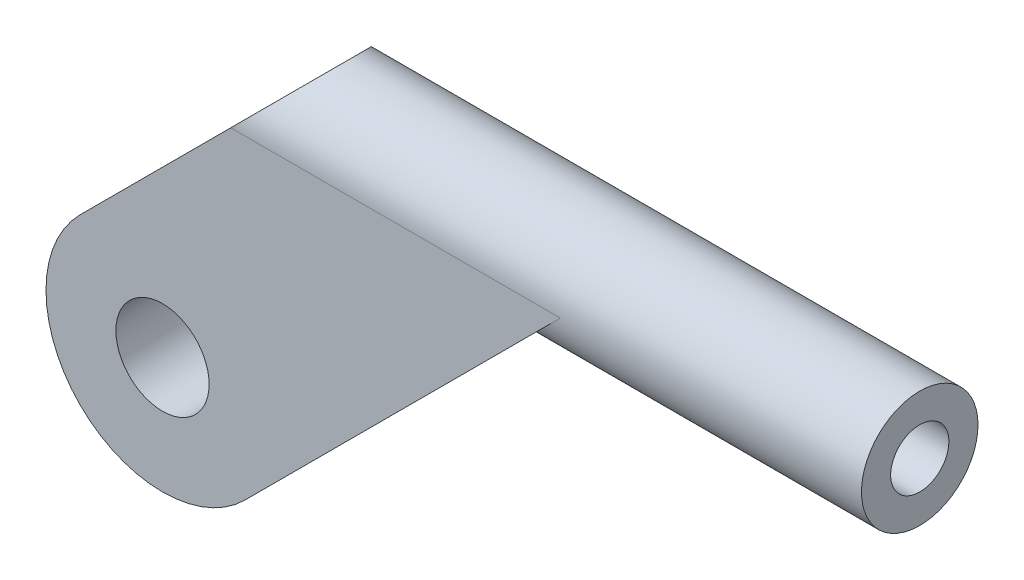
ISO-10303-21;
HEADER;
FILE_DESCRIPTION(('STEP AP214'),'2;1');
FILE_NAME('part.step','',(''),(''),'','','');
FILE_SCHEMA(('AUTOMOTIVE_DESIGN { 1 0 10303 214 1 1 1 1 }'));
ENDSEC;
DATA;
#1=APPLICATION_CONTEXT('core data for automotive mechanical design processes');
#2=APPLICATION_PROTOCOL_DEFINITION('international standard','automotive_design',2000,#1);
#3=PRODUCT_CONTEXT('',#1,'mechanical');
#4=PRODUCT('Part','Part','',(#3));
#5=PRODUCT_RELATED_PRODUCT_CATEGORY('part','',(#4));
#6=PRODUCT_DEFINITION_FORMATION('','',#4);
#7=PRODUCT_DEFINITION_CONTEXT('part definition',#1,'design');
#8=PRODUCT_DEFINITION('design','',#6,#7);
#9=PRODUCT_DEFINITION_SHAPE('','',#8);
#10=(LENGTH_UNIT() NAMED_UNIT(*) SI_UNIT(.MILLI.,.METRE.));
#11=(NAMED_UNIT(*) PLANE_ANGLE_UNIT() SI_UNIT($,.RADIAN.));
#12=(NAMED_UNIT(*) SI_UNIT($,.STERADIAN.) SOLID_ANGLE_UNIT());
#13=UNCERTAINTY_MEASURE_WITH_UNIT(LENGTH_MEASURE(1.E-05),#10,'distance_accuracy_value','');
#14=(GEOMETRIC_REPRESENTATION_CONTEXT(3) GLOBAL_UNCERTAINTY_ASSIGNED_CONTEXT((#13)) GLOBAL_UNIT_ASSIGNED_CONTEXT((#10,
#11,#12)) REPRESENTATION_CONTEXT('',''));
#15=CARTESIAN_POINT('',(0.,0.,0.));
#16=DIRECTION('',(0.,0.,1.));
#17=DIRECTION('',(1.,0.,0.));
#18=AXIS2_PLACEMENT_3D('',#15,#16,#17);
#19=CARTESIAN_POINT('',(0.,0.,-75.));
#20=DIRECTION('',(0.,0.,1.));
#21=DIRECTION('',(1.,0.,0.));
#22=AXIS2_PLACEMENT_3D('',#19,#20,#21);
#23=PLANE('',#22);
#24=CARTESIAN_POINT('',(0.,0.,-75.));
#25=DIRECTION('',(0.,0.,-1.));
#26=DIRECTION('',(-1.,0.,0.));
#27=AXIS2_PLACEMENT_3D('',#24,#25,#26);
#28=CIRCLE('',#27,100.);
#29=CARTESIAN_POINT('',(-100.,0.,-75.));
#30=VERTEX_POINT('',#29);
#31=EDGE_CURVE('E111',#30,#30,#28,.T.);
#32=ORIENTED_EDGE('',*,*,#31,.F.);
#33=EDGE_LOOP('',(#32));
#34=FACE_BOUND('',#33,.T.);
#35=DIRECTION('',(1.,0.,0.));
#36=VECTOR('',#35,1.);
#37=CARTESIAN_POINT('',(-250.001000000001,500.000000000001,-75.));
#38=LINE('',#37,#36);
#39=CARTESIAN_POINT('',(146.446609406725,500.000000000001,-75.));
#40=VERTEX_POINT('',#39);
#41=CARTESIAN_POINT('',(853.553390593275,500.000000000001,-75.));
#42=VERTEX_POINT('',#41);
#43=EDGE_CURVE('E80',#40,#42,#38,.T.);
#44=ORIENTED_EDGE('',*,*,#43,.T.);
#45=DIRECTION('',(0.707106781186548,0.707106781186547,0.));
#46=VECTOR('',#45,1.);
#47=CARTESIAN_POINT('',(176.776695296637,-176.776695296637,-75.));
#48=LINE('',#47,#46);
#49=CARTESIAN_POINT('',(176.776695296637,-176.776695296637,-75.));
#50=VERTEX_POINT('',#49);
#51=EDGE_CURVE('E48',#50,#42,#48,.T.);
#52=ORIENTED_EDGE('',*,*,#51,.F.);
#53=CARTESIAN_POINT('',(0.,0.,-75.));
#54=DIRECTION('',(0.,0.,1.));
#55=DIRECTION('',(1.,0.,0.));
#56=AXIS2_PLACEMENT_3D('',#53,#54,#55);
#57=CIRCLE('',#56,250.000000000001);
#58=CARTESIAN_POINT('',(-176.776695296638,176.776695296638,-75.));
#59=VERTEX_POINT('',#58);
#60=EDGE_CURVE('E103',#59,#50,#57,.T.);
#61=ORIENTED_EDGE('',*,*,#60,.F.);
#62=DIRECTION('',(-0.707106781186547,-0.707106781186548,0.));
#63=VECTOR('',#62,1.);
#64=CARTESIAN_POINT('',(-176.776695296638,176.776695296638,-75.));
#65=LINE('',#64,#63);
#66=EDGE_CURVE('E107',#40,#59,#65,.T.);
#67=ORIENTED_EDGE('',*,*,#66,.F.);
#68=EDGE_LOOP('',(#44,#52,#61,#67));
#69=FACE_BOUND('',#68,.T.);
#70=ADVANCED_FACE('F33',(#34,#69),#23,.F.);
#71=CARTESIAN_POINT('',(0.,0.,175.));
#72=DIRECTION('',(0.,0.,1.));
#73=DIRECTION('',(1.,0.,0.));
#74=AXIS2_PLACEMENT_3D('',#71,#72,#73);
#75=PLANE('',#74);
#76=CARTESIAN_POINT('',(0.,0.,175.));
#77=DIRECTION('',(0.,0.,1.));
#78=DIRECTION('',(1.,0.,0.));
#79=AXIS2_PLACEMENT_3D('',#76,#77,#78);
#80=CIRCLE('',#79,100.);
#81=CARTESIAN_POINT('',(100.,0.,175.));
#82=VERTEX_POINT('',#81);
#83=EDGE_CURVE('E114',#82,#82,#80,.F.);
#84=ORIENTED_EDGE('',*,*,#83,.T.);
#85=EDGE_LOOP('',(#84));
#86=FACE_BOUND('',#85,.T.);
#87=DIRECTION('',(0.707106781186548,0.707106781186547,0.));
#88=VECTOR('',#87,1.);
#89=CARTESIAN_POINT('',(176.776695296637,-176.776695296637,175.));
#90=LINE('',#89,#88);
#91=CARTESIAN_POINT('',(176.776695296637,-176.776695296637,175.));
#92=VERTEX_POINT('',#91);
#93=CARTESIAN_POINT('',(853.553390593275,500.000000000001,175.));
#94=VERTEX_POINT('',#93);
#95=EDGE_CURVE('E56',#92,#94,#90,.T.);
#96=ORIENTED_EDGE('',*,*,#95,.T.);
#97=DIRECTION('',(1.,0.,0.));
#98=VECTOR('',#97,1.);
#99=CARTESIAN_POINT('',(-250.001000000001,500.000000000001,175.));
#100=LINE('',#99,#98);
#101=CARTESIAN_POINT('',(146.446609406725,500.000000000001,175.));
#102=VERTEX_POINT('',#101);
#103=EDGE_CURVE('E79',#102,#94,#100,.T.);
#104=ORIENTED_EDGE('',*,*,#103,.F.);
#105=DIRECTION('',(-0.707106781186547,-0.707106781186548,0.));
#106=VECTOR('',#105,1.);
#107=CARTESIAN_POINT('',(500.,853.553390593276,175.));
#108=LINE('',#107,#106);
#109=CARTESIAN_POINT('',(-176.776695296638,176.776695296638,175.));
#110=VERTEX_POINT('',#109);
#111=EDGE_CURVE('E87',#102,#110,#108,.T.);
#112=ORIENTED_EDGE('',*,*,#111,.T.);
#113=CARTESIAN_POINT('',(0.,0.,175.));
#114=DIRECTION('',(0.,0.,1.));
#115=DIRECTION('',(1.,0.,0.));
#116=AXIS2_PLACEMENT_3D('',#113,#114,#115);
#117=CIRCLE('',#116,250.000000000001);
#118=EDGE_CURVE('E93',#110,#92,#117,.T.);
#119=ORIENTED_EDGE('',*,*,#118,.T.);
#120=EDGE_LOOP('',(#96,#104,#112,#119));
#121=FACE_BOUND('',#120,.T.);
#122=ADVANCED_FACE('F86',(#86,#121),#75,.T.);
#123=CARTESIAN_POINT('',(0.,0.,-75.));
#124=DIRECTION('',(0.,0.,1.));
#125=DIRECTION('',(1.,0.,0.));
#126=AXIS2_PLACEMENT_3D('',#123,#124,#125);
#127=CYLINDRICAL_SURFACE('',#126,250.000000000001);
#128=DIRECTION('',(0.,0.,1.));
#129=VECTOR('',#128,1.);
#130=CARTESIAN_POINT('',(176.776695296637,-176.776695296637,-75.));
#131=LINE('',#130,#129);
#132=EDGE_CURVE('E37',#50,#92,#131,.T.);
#133=ORIENTED_EDGE('',*,*,#132,.T.);
#134=ORIENTED_EDGE('',*,*,#118,.F.);
#135=DIRECTION('',(0.,0.,1.));
#136=VECTOR('',#135,1.);
#137=CARTESIAN_POINT('',(-176.776695296638,176.776695296638,-75.));
#138=LINE('',#137,#136);
#139=EDGE_CURVE('E11',#59,#110,#138,.T.);
#140=ORIENTED_EDGE('',*,*,#139,.F.);
#141=ORIENTED_EDGE('',*,*,#60,.T.);
#142=EDGE_LOOP('',(#133,#134,#140,#141));
#143=FACE_BOUND('',#142,.T.);
#144=ADVANCED_FACE('F35',(#143),#127,.T.);
#145=CARTESIAN_POINT('',(-176.776695296638,176.776695296638,-75.));
#146=DIRECTION('',(-0.707106781186548,0.707106781186547,0.));
#147=DIRECTION('',(-0.707106781186547,-0.707106781186548,0.));
#148=AXIS2_PLACEMENT_3D('',#145,#146,#147);
#149=PLANE('',#148);
#150=CARTESIAN_POINT('',(146.446609406725,500.000000000001,50.));
#151=DIRECTION('',(-0.707106781186548,0.707106781186547,0.));
#152=DIRECTION('',(0.707106781186547,0.707106781186548,0.));
#153=AXIS2_PLACEMENT_3D('',#150,#151,#152);
#154=ELLIPSE('',#153,176.776695296637,125.);
#155=EDGE_CURVE('E76',#102,#40,#154,.T.);
#156=ORIENTED_EDGE('',*,*,#155,.T.);
#157=ORIENTED_EDGE('',*,*,#66,.T.);
#158=ORIENTED_EDGE('',*,*,#139,.T.);
#159=ORIENTED_EDGE('',*,*,#111,.F.);
#160=EDGE_LOOP('',(#156,#157,#158,#159));
#161=FACE_BOUND('',#160,.T.);
#162=ADVANCED_FACE('F90',(#161),#149,.T.);
#163=CARTESIAN_POINT('',(176.776695296637,-176.776695296637,-75.));
#164=DIRECTION('',(0.707106781186547,-0.707106781186548,0.));
#165=DIRECTION('',(0.707106781186548,0.707106781186547,0.));
#166=AXIS2_PLACEMENT_3D('',#163,#164,#165);
#167=PLANE('',#166);
#168=ORIENTED_EDGE('',*,*,#51,.T.);
#169=CARTESIAN_POINT('',(853.553390593275,500.000000000001,50.));
#170=DIRECTION('',(0.707106781186547,-0.707106781186548,0.));
#171=DIRECTION('',(-0.707106781186548,-0.707106781186547,0.));
#172=AXIS2_PLACEMENT_3D('',#169,#170,#171);
#173=ELLIPSE('',#172,176.776695296637,125.);
#174=EDGE_CURVE('E84',#42,#94,#173,.F.);
#175=ORIENTED_EDGE('',*,*,#174,.T.);
#176=ORIENTED_EDGE('',*,*,#95,.F.);
#177=ORIENTED_EDGE('',*,*,#132,.F.);
#178=EDGE_LOOP('',(#168,#175,#176,#177));
#179=FACE_BOUND('',#178,.T.);
#180=ADVANCED_FACE('F110',(#179),#167,.T.);
#181=CARTESIAN_POINT('',(1500.,500.000000000001,50.));
#182=DIRECTION('',(1.,0.,0.));
#183=DIRECTION('',(0.,0.,-1.));
#184=AXIS2_PLACEMENT_3D('',#181,#182,#183);
#185=PLANE('',#184);
#186=CARTESIAN_POINT('',(1500.,500.000000000001,50.));
#187=DIRECTION('',(1.,0.,0.));
#188=DIRECTION('',(0.,0.,-1.));
#189=AXIS2_PLACEMENT_3D('',#186,#187,#188);
#190=CIRCLE('',#189,125.);
#191=CARTESIAN_POINT('',(1500.,500.000000000001,-75.));
#192=VERTEX_POINT('',#191);
#193=EDGE_CURVE('E94',#192,#192,#190,.T.);
#194=ORIENTED_EDGE('',*,*,#193,.T.);
#195=EDGE_LOOP('',(#194));
#196=FACE_BOUND('',#195,.T.);
#197=CARTESIAN_POINT('',(1500.,500.000000000001,50.));
#198=DIRECTION('',(1.,0.,0.));
#199=DIRECTION('',(0.,0.,-1.));
#200=AXIS2_PLACEMENT_3D('',#197,#198,#199);
#201=CIRCLE('',#200,62.5);
#202=CARTESIAN_POINT('',(1500.,500.000000000001,-12.5));
#203=VERTEX_POINT('',#202);
#204=EDGE_CURVE('E98',#203,#203,#201,.T.);
#205=ORIENTED_EDGE('',*,*,#204,.F.);
#206=EDGE_LOOP('',(#205));
#207=FACE_BOUND('',#206,.T.);
#208=ADVANCED_FACE('F135',(#196,#207),#185,.T.);
#209=CARTESIAN_POINT('',(1500.,500.000000000001,50.));
#210=DIRECTION('',(-1.,0.,0.));
#211=DIRECTION('',(0.,0.,1.));
#212=AXIS2_PLACEMENT_3D('',#209,#210,#211);
#213=CYLINDRICAL_SURFACE('',#212,125.);
#214=ORIENTED_EDGE('',*,*,#193,.F.);
#215=EDGE_LOOP('',(#214));
#216=FACE_BOUND('',#215,.T.);
#217=ORIENTED_EDGE('',*,*,#174,.F.);
#218=ORIENTED_EDGE('',*,*,#43,.F.);
#219=ORIENTED_EDGE('',*,*,#155,.F.);
#220=ORIENTED_EDGE('',*,*,#103,.T.);
#221=EDGE_LOOP('',(#217,#218,#219,#220));
#222=FACE_BOUND('',#221,.T.);
#223=ADVANCED_FACE('F78',(#216,#222),#213,.T.);
#224=CARTESIAN_POINT('',(1500.,500.000000000001,50.));
#225=DIRECTION('',(-1.,0.,0.));
#226=DIRECTION('',(0.,0.,1.));
#227=AXIS2_PLACEMENT_3D('',#224,#225,#226);
#228=CYLINDRICAL_SURFACE('',#227,62.5);
#229=ORIENTED_EDGE('',*,*,#204,.T.);
#230=EDGE_LOOP('',(#229));
#231=FACE_BOUND('',#230,.T.);
#232=CARTESIAN_POINT('',(500.,500.000000000001,50.));
#233=DIRECTION('',(1.,0.,0.));
#234=DIRECTION('',(0.,0.,-1.));
#235=AXIS2_PLACEMENT_3D('',#232,#233,#234);
#236=CIRCLE('',#235,62.5);
#237=CARTESIAN_POINT('',(500.,500.000000000001,-12.5));
#238=VERTEX_POINT('',#237);
#239=EDGE_CURVE('E88',#238,#238,#236,.T.);
#240=ORIENTED_EDGE('',*,*,#239,.F.);
#241=EDGE_LOOP('',(#240));
#242=FACE_BOUND('',#241,.T.);
#243=ADVANCED_FACE('F125',(#231,#242),#228,.F.);
#244=CARTESIAN_POINT('',(500.,853.553390593276,-75.));
#245=DIRECTION('',(1.,0.,0.));
#246=DIRECTION('',(0.,1.,0.));
#247=AXIS2_PLACEMENT_3D('',#244,#245,#246);
#248=PLANE('',#247);
#249=ORIENTED_EDGE('',*,*,#239,.T.);
#250=EDGE_LOOP('',(#249));
#251=FACE_BOUND('',#250,.T.);
#252=ADVANCED_FACE('F123',(#251),#248,.T.);
#253=CARTESIAN_POINT('',(0.,0.,175.001));
#254=DIRECTION('',(0.,0.,-1.));
#255=DIRECTION('',(-1.,0.,0.));
#256=AXIS2_PLACEMENT_3D('',#253,#254,#255);
#257=CYLINDRICAL_SURFACE('',#256,100.);
#258=ORIENTED_EDGE('',*,*,#83,.F.);
#259=EDGE_LOOP('',(#258));
#260=FACE_BOUND('',#259,.T.);
#261=ORIENTED_EDGE('',*,*,#31,.T.);
#262=EDGE_LOOP('',(#261));
#263=FACE_BOUND('',#262,.T.);
#264=ADVANCED_FACE('F133',(#260,#263),#257,.F.);
#265=CLOSED_SHELL('',(#70,#122,#144,#162,#180,#208,#223,#243,#252,#264));
#266=MANIFOLD_SOLID_BREP('B2',#265);
#267=ADVANCED_BREP_SHAPE_REPRESENTATION('',(#18,#266),#14);
#268=SHAPE_DEFINITION_REPRESENTATION(#9,#267);
ENDSEC;
END-ISO-10303-21;
